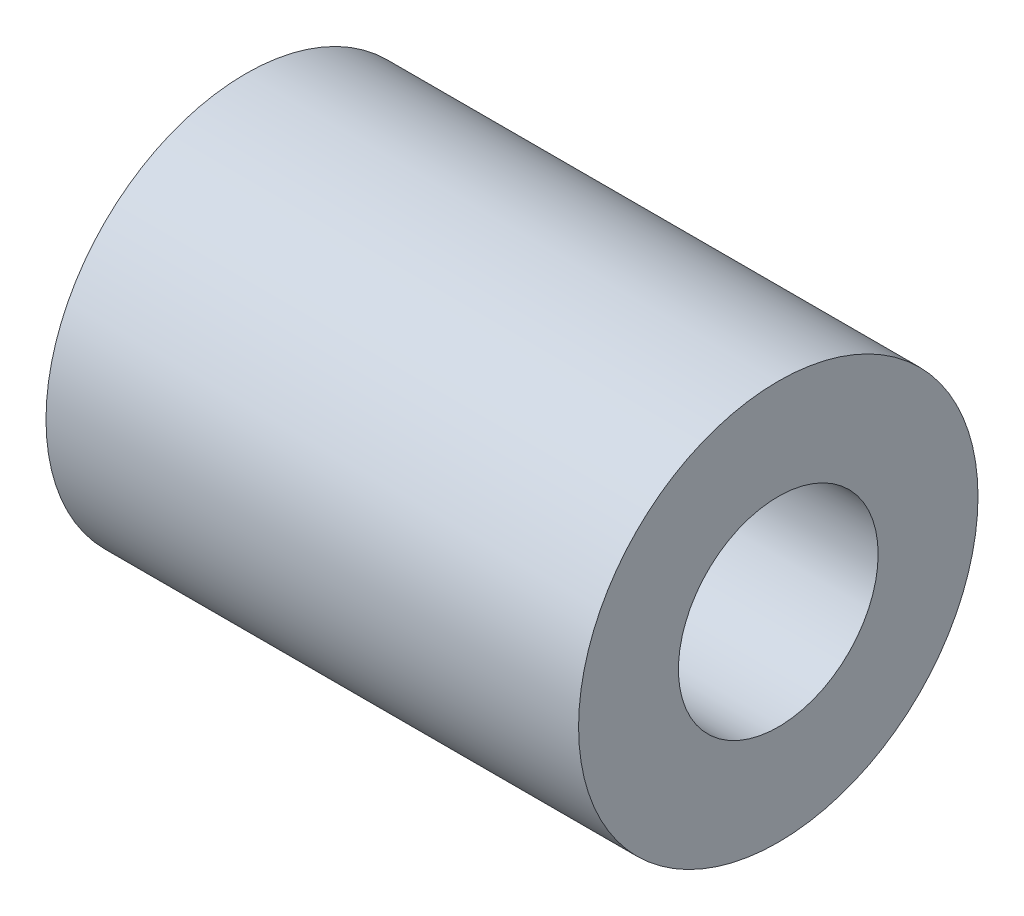
ISO-10303-21;
HEADER;
FILE_DESCRIPTION(('STEP AP214'),'2;1');
FILE_NAME('part.step','',(''),(''),'','','');
FILE_SCHEMA(('AUTOMOTIVE_DESIGN { 1 0 10303 214 1 1 1 1 }'));
ENDSEC;
DATA;
#1=APPLICATION_CONTEXT('core data for automotive mechanical design processes');
#2=APPLICATION_PROTOCOL_DEFINITION('international standard','automotive_design',2000,#1);
#3=PRODUCT_CONTEXT('',#1,'mechanical');
#4=PRODUCT('Part','Part','',(#3));
#5=PRODUCT_RELATED_PRODUCT_CATEGORY('part','',(#4));
#6=PRODUCT_DEFINITION_FORMATION('','',#4);
#7=PRODUCT_DEFINITION_CONTEXT('part definition',#1,'design');
#8=PRODUCT_DEFINITION('design','',#6,#7);
#9=PRODUCT_DEFINITION_SHAPE('','',#8);
#10=(LENGTH_UNIT() NAMED_UNIT(*) SI_UNIT(.MILLI.,.METRE.));
#11=(NAMED_UNIT(*) PLANE_ANGLE_UNIT() SI_UNIT($,.RADIAN.));
#12=(NAMED_UNIT(*) SI_UNIT($,.STERADIAN.) SOLID_ANGLE_UNIT());
#13=UNCERTAINTY_MEASURE_WITH_UNIT(LENGTH_MEASURE(1.E-05),#10,'distance_accuracy_value','');
#14=(GEOMETRIC_REPRESENTATION_CONTEXT(3) GLOBAL_UNCERTAINTY_ASSIGNED_CONTEXT((#13)) GLOBAL_UNIT_ASSIGNED_CONTEXT((#10,
#11,#12)) REPRESENTATION_CONTEXT('',''));
#15=CARTESIAN_POINT('',(0.,0.,0.));
#16=DIRECTION('',(0.,0.,1.));
#17=DIRECTION('',(1.,0.,0.));
#18=AXIS2_PLACEMENT_3D('',#15,#16,#17);
#19=CARTESIAN_POINT('',(8.,0.,0.));
#20=DIRECTION('',(1.,0.,0.));
#21=DIRECTION('',(0.,1.,0.));
#22=AXIS2_PLACEMENT_3D('',#19,#20,#21);
#23=PLANE('',#22);
#24=CARTESIAN_POINT('',(8.,0.,0.));
#25=DIRECTION('',(-1.,0.,0.));
#26=DIRECTION('',(0.,0.,1.));
#27=AXIS2_PLACEMENT_3D('',#24,#25,#26);
#28=CIRCLE('',#27,1.5);
#29=CARTESIAN_POINT('',(8.,0.,-1.5));
#30=VERTEX_POINT('',#29);
#31=EDGE_CURVE('E65',#30,#30,#28,.T.);
#32=ORIENTED_EDGE('',*,*,#31,.T.);
#33=EDGE_LOOP('',(#32));
#34=FACE_BOUND('',#33,.T.);
#35=CARTESIAN_POINT('',(8.,0.,0.));
#36=DIRECTION('',(-1.,0.,0.));
#37=DIRECTION('',(0.,0.,1.));
#38=AXIS2_PLACEMENT_3D('',#35,#36,#37);
#39=CIRCLE('',#38,3.);
#40=CARTESIAN_POINT('',(8.,0.,-3.));
#41=VERTEX_POINT('',#40);
#42=EDGE_CURVE('E57',#41,#41,#39,.T.);
#43=ORIENTED_EDGE('',*,*,#42,.F.);
#44=EDGE_LOOP('',(#43));
#45=FACE_BOUND('',#44,.T.);
#46=ADVANCED_FACE('F17',(#34,#45),#23,.T.);
#47=CARTESIAN_POINT('',(0.,0.,0.));
#48=DIRECTION('',(1.,0.,0.));
#49=DIRECTION('',(0.,1.,0.));
#50=AXIS2_PLACEMENT_3D('',#47,#48,#49);
#51=PLANE('',#50);
#52=CARTESIAN_POINT('',(0.,0.,0.));
#53=DIRECTION('',(-1.,0.,0.));
#54=DIRECTION('',(0.,0.,1.));
#55=AXIS2_PLACEMENT_3D('',#52,#53,#54);
#56=CIRCLE('',#55,1.5);
#57=CARTESIAN_POINT('',(0.,0.,-1.5));
#58=VERTEX_POINT('',#57);
#59=EDGE_CURVE('E11',#58,#58,#56,.T.);
#60=ORIENTED_EDGE('',*,*,#59,.F.);
#61=EDGE_LOOP('',(#60));
#62=FACE_BOUND('',#61,.T.);
#63=CARTESIAN_POINT('',(0.,0.,0.));
#64=DIRECTION('',(1.,0.,0.));
#65=DIRECTION('',(0.,0.,1.));
#66=AXIS2_PLACEMENT_3D('',#63,#64,#65);
#67=CIRCLE('',#66,3.);
#68=CARTESIAN_POINT('',(0.,0.,-3.));
#69=VERTEX_POINT('',#68);
#70=EDGE_CURVE('E55',#69,#69,#67,.T.);
#71=ORIENTED_EDGE('',*,*,#70,.F.);
#72=EDGE_LOOP('',(#71));
#73=FACE_BOUND('',#72,.T.);
#74=ADVANCED_FACE('F79',(#62,#73),#51,.F.);
#75=CARTESIAN_POINT('',(8.,0.,0.));
#76=DIRECTION('',(-1.,0.,0.));
#77=DIRECTION('',(0.,0.,1.));
#78=AXIS2_PLACEMENT_3D('',#75,#76,#77);
#79=CYLINDRICAL_SURFACE('',#78,1.5);
#80=ORIENTED_EDGE('',*,*,#31,.F.);
#81=DIRECTION('',(-1.,0.,0.));
#82=VECTOR('',#81,1.);
#83=CARTESIAN_POINT('',(8.,0.,-1.5));
#84=LINE('',#83,#82);
#85=EDGE_CURVE('E25',#30,#58,#84,.T.);
#86=ORIENTED_EDGE('',*,*,#85,.T.);
#87=ORIENTED_EDGE('',*,*,#59,.T.);
#88=ORIENTED_EDGE('',*,*,#85,.F.);
#89=EDGE_LOOP('',(#80,#86,#87,#88));
#90=FACE_BOUND('',#89,.T.);
#91=ADVANCED_FACE('F77',(#90),#79,.F.);
#92=CARTESIAN_POINT('',(8.,0.,0.));
#93=DIRECTION('',(-1.,0.,0.));
#94=DIRECTION('',(0.,0.,1.));
#95=AXIS2_PLACEMENT_3D('',#92,#93,#94);
#96=CYLINDRICAL_SURFACE('',#95,3.);
#97=ORIENTED_EDGE('',*,*,#70,.T.);
#98=DIRECTION('',(1.,0.,0.));
#99=VECTOR('',#98,1.);
#100=CARTESIAN_POINT('',(8.,0.,-3.));
#101=LINE('',#100,#99);
#102=EDGE_CURVE('E52',#69,#41,#101,.T.);
#103=ORIENTED_EDGE('',*,*,#102,.T.);
#104=ORIENTED_EDGE('',*,*,#42,.T.);
#105=ORIENTED_EDGE('',*,*,#102,.F.);
#106=EDGE_LOOP('',(#97,#103,#104,#105));
#107=FACE_BOUND('',#106,.T.);
#108=ADVANCED_FACE('F53',(#107),#96,.T.);
#109=CLOSED_SHELL('',(#46,#74,#91,#108));
#110=MANIFOLD_SOLID_BREP('B1',#109);
#111=ADVANCED_BREP_SHAPE_REPRESENTATION('',(#18,#110),#14);
#112=SHAPE_DEFINITION_REPRESENTATION(#9,#111);
ENDSEC;
END-ISO-10303-21;
